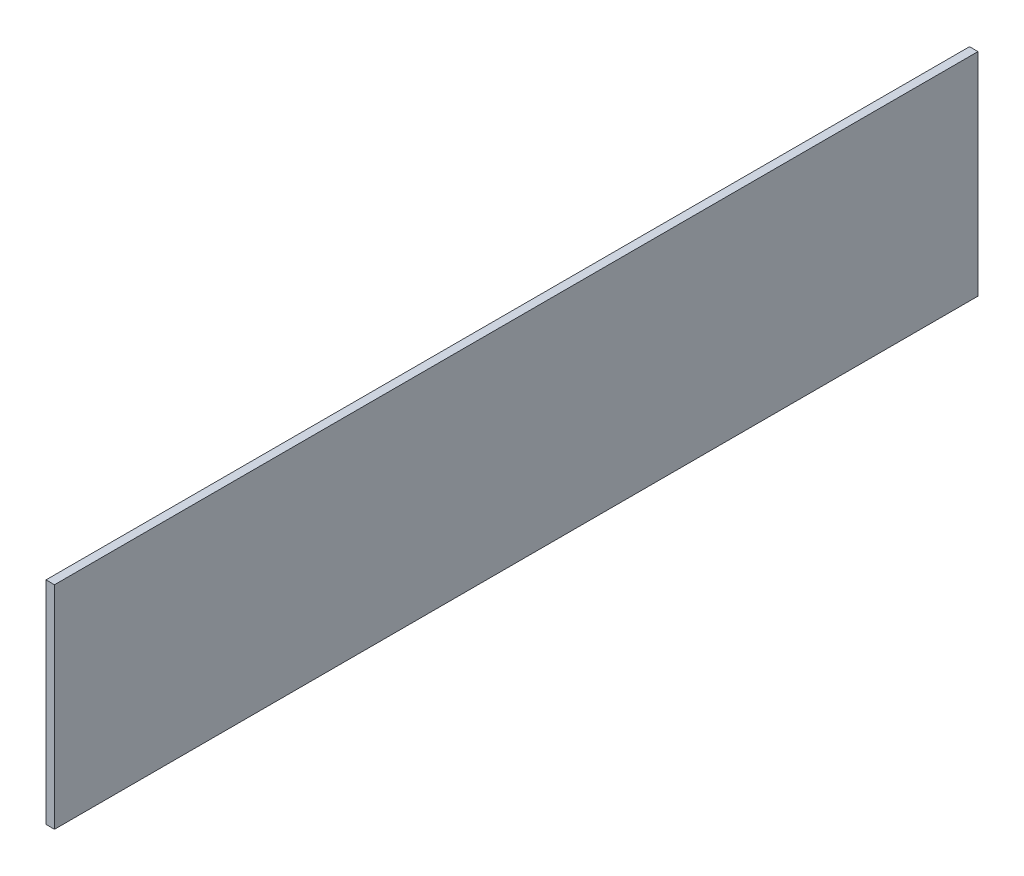
ISO-10303-21;
HEADER;
FILE_DESCRIPTION(('STEP AP214'),'2;1');
FILE_NAME('part.step','',(''),(''),'','','');
FILE_SCHEMA(('AUTOMOTIVE_DESIGN { 1 0 10303 214 1 1 1 1 }'));
ENDSEC;
DATA;
#1=APPLICATION_CONTEXT('core data for automotive mechanical design processes');
#2=APPLICATION_PROTOCOL_DEFINITION('international standard','automotive_design',2000,#1);
#3=PRODUCT_CONTEXT('',#1,'mechanical');
#4=PRODUCT('Part','Part','',(#3));
#5=PRODUCT_RELATED_PRODUCT_CATEGORY('part','',(#4));
#6=PRODUCT_DEFINITION_FORMATION('','',#4);
#7=PRODUCT_DEFINITION_CONTEXT('part definition',#1,'design');
#8=PRODUCT_DEFINITION('design','',#6,#7);
#9=PRODUCT_DEFINITION_SHAPE('','',#8);
#10=(LENGTH_UNIT() NAMED_UNIT(*) SI_UNIT(.MILLI.,.METRE.));
#11=(NAMED_UNIT(*) PLANE_ANGLE_UNIT() SI_UNIT($,.RADIAN.));
#12=(NAMED_UNIT(*) SI_UNIT($,.STERADIAN.) SOLID_ANGLE_UNIT());
#13=UNCERTAINTY_MEASURE_WITH_UNIT(LENGTH_MEASURE(1.E-05),#10,'distance_accuracy_value','');
#14=(GEOMETRIC_REPRESENTATION_CONTEXT(3) GLOBAL_UNCERTAINTY_ASSIGNED_CONTEXT((#13)) GLOBAL_UNIT_ASSIGNED_CONTEXT((#10,
#11,#12)) REPRESENTATION_CONTEXT('',''));
#15=CARTESIAN_POINT('',(0.,0.,0.));
#16=DIRECTION('',(0.,0.,1.));
#17=DIRECTION('',(1.,0.,0.));
#18=AXIS2_PLACEMENT_3D('',#15,#16,#17);
#19=CARTESIAN_POINT('',(1.,0.,109.));
#20=DIRECTION('',(0.,0.,-1.));
#21=DIRECTION('',(0.,1.,0.));
#22=AXIS2_PLACEMENT_3D('',#19,#20,#21);
#23=PLANE('',#22);
#24=DIRECTION('',(0.,-1.,0.));
#25=VECTOR('',#24,1.);
#26=CARTESIAN_POINT('',(-1.,0.,109.));
#27=LINE('',#26,#25);
#28=CARTESIAN_POINT('',(-1.,50.,109.));
#29=VERTEX_POINT('',#28);
#30=CARTESIAN_POINT('',(-1.,0.,109.));
#31=VERTEX_POINT('',#30);
#32=EDGE_CURVE('E107',#29,#31,#27,.T.);
#33=ORIENTED_EDGE('',*,*,#32,.T.);
#34=DIRECTION('',(-1.,0.,0.));
#35=VECTOR('',#34,1.);
#36=CARTESIAN_POINT('',(1.,0.,109.));
#37=LINE('',#36,#35);
#38=CARTESIAN_POINT('',(1.,0.,109.));
#39=VERTEX_POINT('',#38);
#40=EDGE_CURVE('E11',#39,#31,#37,.T.);
#41=ORIENTED_EDGE('',*,*,#40,.F.);
#42=DIRECTION('',(0.,-1.,0.));
#43=VECTOR('',#42,1.);
#44=CARTESIAN_POINT('',(1.,0.,109.));
#45=LINE('',#44,#43);
#46=CARTESIAN_POINT('',(1.,50.,109.));
#47=VERTEX_POINT('',#46);
#48=EDGE_CURVE('E91',#47,#39,#45,.T.);
#49=ORIENTED_EDGE('',*,*,#48,.F.);
#50=DIRECTION('',(-1.,0.,0.));
#51=VECTOR('',#50,1.);
#52=CARTESIAN_POINT('',(1.,50.,109.));
#53=LINE('',#52,#51);
#54=EDGE_CURVE('E103',#47,#29,#53,.T.);
#55=ORIENTED_EDGE('',*,*,#54,.T.);
#56=EDGE_LOOP('',(#33,#41,#49,#55));
#57=FACE_BOUND('',#56,.T.);
#58=ADVANCED_FACE('F39',(#57),#23,.F.);
#59=CARTESIAN_POINT('',(1.,0.,109.));
#60=DIRECTION('',(0.,1.,0.));
#61=DIRECTION('',(0.,0.,1.));
#62=AXIS2_PLACEMENT_3D('',#59,#60,#61);
#63=PLANE('',#62);
#64=DIRECTION('',(0.,0.,-1.));
#65=VECTOR('',#64,1.);
#66=CARTESIAN_POINT('',(-1.,0.,109.));
#67=LINE('',#66,#65);
#68=CARTESIAN_POINT('',(-1.,0.,-109.));
#69=VERTEX_POINT('',#68);
#70=EDGE_CURVE('E96',#31,#69,#67,.T.);
#71=ORIENTED_EDGE('',*,*,#70,.T.);
#72=DIRECTION('',(-1.,0.,0.));
#73=VECTOR('',#72,1.);
#74=CARTESIAN_POINT('',(1.,0.,-109.));
#75=LINE('',#74,#73);
#76=CARTESIAN_POINT('',(1.,0.,-109.));
#77=VERTEX_POINT('',#76);
#78=EDGE_CURVE('E48',#77,#69,#75,.T.);
#79=ORIENTED_EDGE('',*,*,#78,.F.);
#80=DIRECTION('',(0.,0.,-1.));
#81=VECTOR('',#80,1.);
#82=CARTESIAN_POINT('',(1.,0.,109.));
#83=LINE('',#82,#81);
#84=EDGE_CURVE('E86',#39,#77,#83,.T.);
#85=ORIENTED_EDGE('',*,*,#84,.F.);
#86=ORIENTED_EDGE('',*,*,#40,.T.);
#87=EDGE_LOOP('',(#71,#79,#85,#86));
#88=FACE_BOUND('',#87,.T.);
#89=ADVANCED_FACE('F95',(#88),#63,.F.);
#90=CARTESIAN_POINT('',(1.,0.,-109.));
#91=DIRECTION('',(0.,0.,1.));
#92=DIRECTION('',(1.,0.,0.));
#93=AXIS2_PLACEMENT_3D('',#90,#91,#92);
#94=PLANE('',#93);
#95=DIRECTION('',(0.,1.,0.));
#96=VECTOR('',#95,1.);
#97=CARTESIAN_POINT('',(-1.,0.,-109.));
#98=LINE('',#97,#96);
#99=CARTESIAN_POINT('',(-1.,50.,-109.));
#100=VERTEX_POINT('',#99);
#101=EDGE_CURVE('E73',#69,#100,#98,.T.);
#102=ORIENTED_EDGE('',*,*,#101,.T.);
#103=DIRECTION('',(-1.,0.,0.));
#104=VECTOR('',#103,1.);
#105=CARTESIAN_POINT('',(1.,50.,-109.));
#106=LINE('',#105,#104);
#107=CARTESIAN_POINT('',(1.,50.,-109.));
#108=VERTEX_POINT('',#107);
#109=EDGE_CURVE('E98',#108,#100,#106,.T.);
#110=ORIENTED_EDGE('',*,*,#109,.F.);
#111=DIRECTION('',(0.,1.,0.));
#112=VECTOR('',#111,1.);
#113=CARTESIAN_POINT('',(1.,0.,-109.));
#114=LINE('',#113,#112);
#115=EDGE_CURVE('E89',#77,#108,#114,.T.);
#116=ORIENTED_EDGE('',*,*,#115,.F.);
#117=ORIENTED_EDGE('',*,*,#78,.T.);
#118=EDGE_LOOP('',(#102,#110,#116,#117));
#119=FACE_BOUND('',#118,.T.);
#120=ADVANCED_FACE('F99',(#119),#94,.F.);
#121=CARTESIAN_POINT('',(1.,50.,109.));
#122=DIRECTION('',(0.,-1.,0.));
#123=DIRECTION('',(0.,0.,-1.));
#124=AXIS2_PLACEMENT_3D('',#121,#122,#123);
#125=PLANE('',#124);
#126=DIRECTION('',(0.,0.,1.));
#127=VECTOR('',#126,1.);
#128=CARTESIAN_POINT('',(-1.,50.,109.));
#129=LINE('',#128,#127);
#130=EDGE_CURVE('E79',#100,#29,#129,.T.);
#131=ORIENTED_EDGE('',*,*,#130,.T.);
#132=ORIENTED_EDGE('',*,*,#54,.F.);
#133=DIRECTION('',(0.,0.,1.));
#134=VECTOR('',#133,1.);
#135=CARTESIAN_POINT('',(1.,50.,109.));
#136=LINE('',#135,#134);
#137=EDGE_CURVE('E56',#108,#47,#136,.T.);
#138=ORIENTED_EDGE('',*,*,#137,.F.);
#139=ORIENTED_EDGE('',*,*,#109,.T.);
#140=EDGE_LOOP('',(#131,#132,#138,#139));
#141=FACE_BOUND('',#140,.T.);
#142=ADVANCED_FACE('F120',(#141),#125,.F.);
#143=CARTESIAN_POINT('',(1.,0.,0.));
#144=DIRECTION('',(-1.,0.,0.));
#145=DIRECTION('',(0.,0.,1.));
#146=AXIS2_PLACEMENT_3D('',#143,#144,#145);
#147=PLANE('',#146);
#148=ORIENTED_EDGE('',*,*,#48,.T.);
#149=ORIENTED_EDGE('',*,*,#84,.T.);
#150=ORIENTED_EDGE('',*,*,#115,.T.);
#151=ORIENTED_EDGE('',*,*,#137,.T.);
#152=EDGE_LOOP('',(#148,#149,#150,#151));
#153=FACE_BOUND('',#152,.T.);
#154=ADVANCED_FACE('F87',(#153),#147,.F.);
#155=CARTESIAN_POINT('',(-1.,0.,0.));
#156=DIRECTION('',(-1.,0.,0.));
#157=DIRECTION('',(0.,0.,1.));
#158=AXIS2_PLACEMENT_3D('',#155,#156,#157);
#159=PLANE('',#158);
#160=ORIENTED_EDGE('',*,*,#32,.F.);
#161=ORIENTED_EDGE('',*,*,#130,.F.);
#162=ORIENTED_EDGE('',*,*,#101,.F.);
#163=ORIENTED_EDGE('',*,*,#70,.F.);
#164=EDGE_LOOP('',(#160,#161,#162,#163));
#165=FACE_BOUND('',#164,.T.);
#166=ADVANCED_FACE('F123',(#165),#159,.T.);
#167=CLOSED_SHELL('',(#58,#89,#120,#142,#154,#166));
#168=MANIFOLD_SOLID_BREP('B2',#167);
#169=ADVANCED_BREP_SHAPE_REPRESENTATION('',(#18,#168),#14);
#170=SHAPE_DEFINITION_REPRESENTATION(#9,#169);
ENDSEC;
END-ISO-10303-21;
